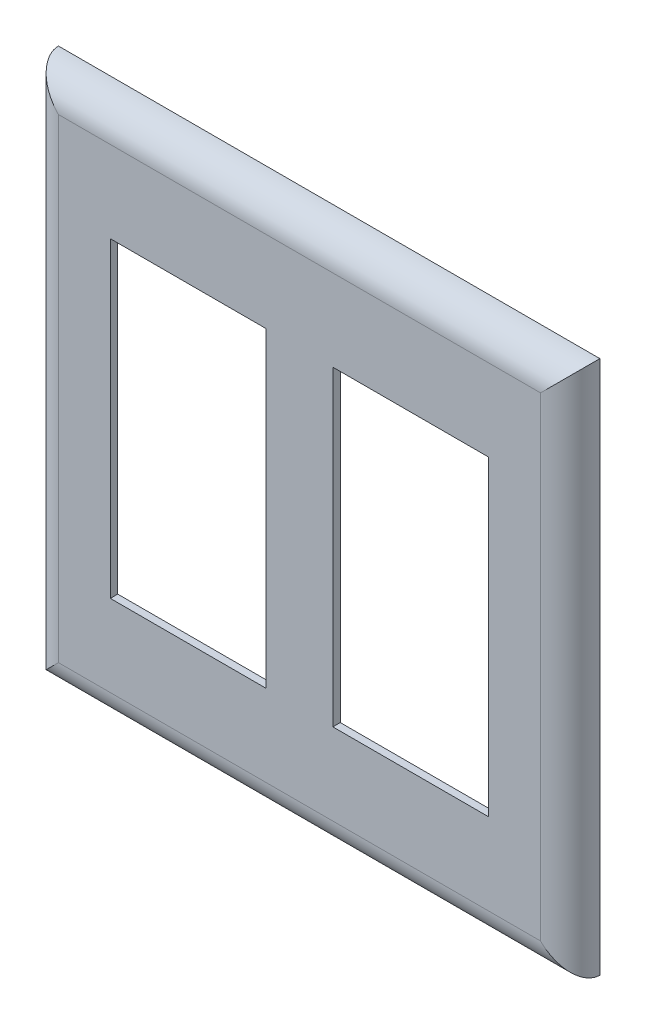
ISO-10303-21;
HEADER;
FILE_DESCRIPTION(('STEP AP214'),'2;1');
FILE_NAME('part.step','',(''),(''),'','','');
FILE_SCHEMA(('AUTOMOTIVE_DESIGN { 1 0 10303 214 1 1 1 1 }'));
ENDSEC;
DATA;
#1=APPLICATION_CONTEXT('core data for automotive mechanical design processes');
#2=APPLICATION_PROTOCOL_DEFINITION('international standard','automotive_design',2000,#1);
#3=PRODUCT_CONTEXT('',#1,'mechanical');
#4=PRODUCT('Part','Part','',(#3));
#5=PRODUCT_RELATED_PRODUCT_CATEGORY('part','',(#4));
#6=PRODUCT_DEFINITION_FORMATION('','',#4);
#7=PRODUCT_DEFINITION_CONTEXT('part definition',#1,'design');
#8=PRODUCT_DEFINITION('design','',#6,#7);
#9=PRODUCT_DEFINITION_SHAPE('','',#8);
#10=(LENGTH_UNIT() NAMED_UNIT(*) SI_UNIT(.MILLI.,.METRE.));
#11=(NAMED_UNIT(*) PLANE_ANGLE_UNIT() SI_UNIT($,.RADIAN.));
#12=(NAMED_UNIT(*) SI_UNIT($,.STERADIAN.) SOLID_ANGLE_UNIT());
#13=UNCERTAINTY_MEASURE_WITH_UNIT(LENGTH_MEASURE(1.E-05),#10,'distance_accuracy_value','');
#14=(GEOMETRIC_REPRESENTATION_CONTEXT(3) GLOBAL_UNCERTAINTY_ASSIGNED_CONTEXT((#13)) GLOBAL_UNIT_ASSIGNED_CONTEXT((#10,
#11,#12)) REPRESENTATION_CONTEXT('',''));
#15=CARTESIAN_POINT('',(0.,0.,0.));
#16=DIRECTION('',(0.,0.,1.));
#17=DIRECTION('',(1.,0.,0.));
#18=AXIS2_PLACEMENT_3D('',#15,#16,#17);
#19=CARTESIAN_POINT('',(-40.48896695132,33.3375,6.35));
#20=DIRECTION('',(1.,0.,0.));
#21=DIRECTION('',(0.,1.,0.));
#22=AXIS2_PLACEMENT_3D('',#19,#20,#21);
#23=PLANE('',#22);
#24=DIRECTION('',(0.,0.,-1.));
#25=VECTOR('',#24,1.);
#26=CARTESIAN_POINT('',(-40.48896695132,-33.3375,6.35));
#27=LINE('',#26,#25);
#28=CARTESIAN_POINT('',(-40.48896695132,-33.3375,6.35));
#29=VERTEX_POINT('',#28);
#30=CARTESIAN_POINT('',(-40.48896695132,-33.3375,4.7625));
#31=VERTEX_POINT('',#30);
#32=EDGE_CURVE('E299',#29,#31,#27,.T.);
#33=ORIENTED_EDGE('',*,*,#32,.T.);
#34=DIRECTION('',(0.,1.,0.));
#35=VECTOR('',#34,1.);
#36=CARTESIAN_POINT('',(-40.48896695132,33.3375,4.7625));
#37=LINE('',#36,#35);
#38=CARTESIAN_POINT('',(-40.48896695132,33.3375,4.7625));
#39=VERTEX_POINT('',#38);
#40=EDGE_CURVE('E241',#31,#39,#37,.T.);
#41=ORIENTED_EDGE('',*,*,#40,.T.);
#42=DIRECTION('',(0.,0.,-1.));
#43=VECTOR('',#42,1.);
#44=CARTESIAN_POINT('',(-40.48896695132,33.3375,6.35));
#45=LINE('',#44,#43);
#46=CARTESIAN_POINT('',(-40.48896695132,33.3375,6.35));
#47=VERTEX_POINT('',#46);
#48=EDGE_CURVE('E287',#47,#39,#45,.T.);
#49=ORIENTED_EDGE('',*,*,#48,.F.);
#50=DIRECTION('',(0.,-1.,0.));
#51=VECTOR('',#50,1.);
#52=CARTESIAN_POINT('',(-40.48896695132,33.3375,6.35));
#53=LINE('',#52,#51);
#54=EDGE_CURVE('E274',#47,#29,#53,.T.);
#55=ORIENTED_EDGE('',*,*,#54,.T.);
#56=EDGE_LOOP('',(#33,#41,#49,#55));
#57=FACE_BOUND('',#56,.T.);
#58=ADVANCED_FACE('F39',(#57),#23,.T.);
#59=CARTESIAN_POINT('',(-40.48896695132,-33.3375,6.35));
#60=DIRECTION('',(0.,1.,0.));
#61=DIRECTION('',(0.,0.,1.));
#62=AXIS2_PLACEMENT_3D('',#59,#60,#61);
#63=PLANE('',#62);
#64=DIRECTION('',(0.,0.,-1.));
#65=VECTOR('',#64,1.);
#66=CARTESIAN_POINT('',(-7.15146695131999,-33.3375,6.35));
#67=LINE('',#66,#65);
#68=CARTESIAN_POINT('',(-7.15146695131999,-33.3375,6.35));
#69=VERTEX_POINT('',#68);
#70=CARTESIAN_POINT('',(-7.15146695131999,-33.3375,4.7625));
#71=VERTEX_POINT('',#70);
#72=EDGE_CURVE('E295',#69,#71,#67,.T.);
#73=ORIENTED_EDGE('',*,*,#72,.T.);
#74=DIRECTION('',(-1.,0.,0.));
#75=VECTOR('',#74,1.);
#76=CARTESIAN_POINT('',(-40.48896695132,-33.3375,4.7625));
#77=LINE('',#76,#75);
#78=EDGE_CURVE('E237',#71,#31,#77,.T.);
#79=ORIENTED_EDGE('',*,*,#78,.T.);
#80=ORIENTED_EDGE('',*,*,#32,.F.);
#81=DIRECTION('',(1.,0.,0.));
#82=VECTOR('',#81,1.);
#83=CARTESIAN_POINT('',(-40.48896695132,-33.3375,6.35));
#84=LINE('',#83,#82);
#85=EDGE_CURVE('E277',#29,#69,#84,.T.);
#86=ORIENTED_EDGE('',*,*,#85,.T.);
#87=EDGE_LOOP('',(#73,#79,#80,#86));
#88=FACE_BOUND('',#87,.T.);
#89=ADVANCED_FACE('F351',(#88),#63,.T.);
#90=CARTESIAN_POINT('',(-7.15146695132,33.3375,6.35));
#91=DIRECTION('',(-1.,0.,0.));
#92=DIRECTION('',(0.,-1.,0.));
#93=AXIS2_PLACEMENT_3D('',#90,#91,#92);
#94=PLANE('',#93);
#95=DIRECTION('',(0.,0.,-1.));
#96=VECTOR('',#95,1.);
#97=CARTESIAN_POINT('',(-7.15146695132,33.3375,6.35));
#98=LINE('',#97,#96);
#99=CARTESIAN_POINT('',(-7.15146695132,33.3375,6.35));
#100=VERTEX_POINT('',#99);
#101=CARTESIAN_POINT('',(-7.15146695132,33.3375,4.7625));
#102=VERTEX_POINT('',#101);
#103=EDGE_CURVE('E291',#100,#102,#98,.T.);
#104=ORIENTED_EDGE('',*,*,#103,.T.);
#105=DIRECTION('',(0.,-1.,0.));
#106=VECTOR('',#105,1.);
#107=CARTESIAN_POINT('',(-7.15146695132,33.3375,4.7625));
#108=LINE('',#107,#106);
#109=EDGE_CURVE('E233',#102,#71,#108,.T.);
#110=ORIENTED_EDGE('',*,*,#109,.T.);
#111=ORIENTED_EDGE('',*,*,#72,.F.);
#112=DIRECTION('',(0.,1.,0.));
#113=VECTOR('',#112,1.);
#114=CARTESIAN_POINT('',(-7.15146695132,33.3375,6.35));
#115=LINE('',#114,#113);
#116=EDGE_CURVE('E280',#69,#100,#115,.T.);
#117=ORIENTED_EDGE('',*,*,#116,.T.);
#118=EDGE_LOOP('',(#104,#110,#111,#117));
#119=FACE_BOUND('',#118,.T.);
#120=ADVANCED_FACE('F357',(#119),#94,.T.);
#121=CARTESIAN_POINT('',(-40.48896695132,33.3375,6.35));
#122=DIRECTION('',(0.,-1.,0.));
#123=DIRECTION('',(0.,0.,-1.));
#124=AXIS2_PLACEMENT_3D('',#121,#122,#123);
#125=PLANE('',#124);
#126=ORIENTED_EDGE('',*,*,#48,.T.);
#127=DIRECTION('',(1.,0.,0.));
#128=VECTOR('',#127,1.);
#129=CARTESIAN_POINT('',(-40.48896695132,33.3375,4.7625));
#130=LINE('',#129,#128);
#131=EDGE_CURVE('E229',#39,#102,#130,.T.);
#132=ORIENTED_EDGE('',*,*,#131,.T.);
#133=ORIENTED_EDGE('',*,*,#103,.F.);
#134=DIRECTION('',(-1.,0.,0.));
#135=VECTOR('',#134,1.);
#136=CARTESIAN_POINT('',(-40.48896695132,33.3375,6.35));
#137=LINE('',#136,#135);
#138=EDGE_CURVE('E284',#100,#47,#137,.T.);
#139=ORIENTED_EDGE('',*,*,#138,.T.);
#140=EDGE_LOOP('',(#126,#132,#133,#139));
#141=FACE_BOUND('',#140,.T.);
#142=ADVANCED_FACE('F482',(#141),#125,.T.);
#143=CARTESIAN_POINT('',(7.14375,33.3375,6.35));
#144=DIRECTION('',(1.,0.,0.));
#145=DIRECTION('',(0.,1.,0.));
#146=AXIS2_PLACEMENT_3D('',#143,#144,#145);
#147=PLANE('',#146);
#148=DIRECTION('',(0.,0.,-1.));
#149=VECTOR('',#148,1.);
#150=CARTESIAN_POINT('',(7.14375000000001,-33.3375,6.35));
#151=LINE('',#150,#149);
#152=CARTESIAN_POINT('',(7.14375000000001,-33.3375,6.35));
#153=VERTEX_POINT('',#152);
#154=CARTESIAN_POINT('',(7.14375000000001,-33.3375,4.7625));
#155=VERTEX_POINT('',#154);
#156=EDGE_CURVE('E270',#153,#155,#151,.T.);
#157=ORIENTED_EDGE('',*,*,#156,.T.);
#158=DIRECTION('',(0.,1.,0.));
#159=VECTOR('',#158,1.);
#160=CARTESIAN_POINT('',(7.14375,33.3375,4.7625));
#161=LINE('',#160,#159);
#162=CARTESIAN_POINT('',(7.14375,33.3375,4.7625));
#163=VERTEX_POINT('',#162);
#164=EDGE_CURVE('E225',#155,#163,#161,.T.);
#165=ORIENTED_EDGE('',*,*,#164,.T.);
#166=DIRECTION('',(0.,0.,-1.));
#167=VECTOR('',#166,1.);
#168=CARTESIAN_POINT('',(7.14375,33.3375,6.35));
#169=LINE('',#168,#167);
#170=CARTESIAN_POINT('',(7.14375,33.3375,6.35));
#171=VERTEX_POINT('',#170);
#172=EDGE_CURVE('E258',#171,#163,#169,.T.);
#173=ORIENTED_EDGE('',*,*,#172,.F.);
#174=DIRECTION('',(0.,-1.,0.));
#175=VECTOR('',#174,1.);
#176=CARTESIAN_POINT('',(7.14375,33.3375,6.35));
#177=LINE('',#176,#175);
#178=EDGE_CURVE('E245',#171,#153,#177,.T.);
#179=ORIENTED_EDGE('',*,*,#178,.T.);
#180=EDGE_LOOP('',(#157,#165,#173,#179));
#181=FACE_BOUND('',#180,.T.);
#182=ADVANCED_FACE('F472',(#181),#147,.T.);
#183=CARTESIAN_POINT('',(7.14375000000001,-33.3375,6.35));
#184=DIRECTION('',(0.,1.,0.));
#185=DIRECTION('',(0.,0.,1.));
#186=AXIS2_PLACEMENT_3D('',#183,#184,#185);
#187=PLANE('',#186);
#188=DIRECTION('',(0.,0.,-1.));
#189=VECTOR('',#188,1.);
#190=CARTESIAN_POINT('',(40.48125,-33.3375,6.35));
#191=LINE('',#190,#189);
#192=CARTESIAN_POINT('',(40.48125,-33.3375,6.35));
#193=VERTEX_POINT('',#192);
#194=CARTESIAN_POINT('',(40.48125,-33.3375,4.7625));
#195=VERTEX_POINT('',#194);
#196=EDGE_CURVE('E266',#193,#195,#191,.T.);
#197=ORIENTED_EDGE('',*,*,#196,.T.);
#198=DIRECTION('',(-1.,0.,0.));
#199=VECTOR('',#198,1.);
#200=CARTESIAN_POINT('',(7.14375000000001,-33.3375,4.7625));
#201=LINE('',#200,#199);
#202=EDGE_CURVE('E221',#195,#155,#201,.T.);
#203=ORIENTED_EDGE('',*,*,#202,.T.);
#204=ORIENTED_EDGE('',*,*,#156,.F.);
#205=DIRECTION('',(1.,0.,0.));
#206=VECTOR('',#205,1.);
#207=CARTESIAN_POINT('',(7.14375000000001,-33.3375,6.35));
#208=LINE('',#207,#206);
#209=EDGE_CURVE('E248',#153,#193,#208,.T.);
#210=ORIENTED_EDGE('',*,*,#209,.T.);
#211=EDGE_LOOP('',(#197,#203,#204,#210));
#212=FACE_BOUND('',#211,.T.);
#213=ADVANCED_FACE('F462',(#212),#187,.T.);
#214=CARTESIAN_POINT('',(40.48125,33.3375,6.35));
#215=DIRECTION('',(-1.,0.,0.));
#216=DIRECTION('',(0.,-1.,0.));
#217=AXIS2_PLACEMENT_3D('',#214,#215,#216);
#218=PLANE('',#217);
#219=DIRECTION('',(0.,0.,-1.));
#220=VECTOR('',#219,1.);
#221=CARTESIAN_POINT('',(40.48125,33.3375,6.35));
#222=LINE('',#221,#220);
#223=CARTESIAN_POINT('',(40.48125,33.3375,6.35));
#224=VERTEX_POINT('',#223);
#225=CARTESIAN_POINT('',(40.48125,33.3375,4.7625));
#226=VERTEX_POINT('',#225);
#227=EDGE_CURVE('E262',#224,#226,#222,.T.);
#228=ORIENTED_EDGE('',*,*,#227,.T.);
#229=DIRECTION('',(0.,-1.,0.));
#230=VECTOR('',#229,1.);
#231=CARTESIAN_POINT('',(40.48125,33.3375,4.7625));
#232=LINE('',#231,#230);
#233=EDGE_CURVE('E217',#226,#195,#232,.T.);
#234=ORIENTED_EDGE('',*,*,#233,.T.);
#235=ORIENTED_EDGE('',*,*,#196,.F.);
#236=DIRECTION('',(0.,1.,0.));
#237=VECTOR('',#236,1.);
#238=CARTESIAN_POINT('',(40.48125,33.3375,6.35));
#239=LINE('',#238,#237);
#240=EDGE_CURVE('E251',#193,#224,#239,.T.);
#241=ORIENTED_EDGE('',*,*,#240,.T.);
#242=EDGE_LOOP('',(#228,#234,#235,#241));
#243=FACE_BOUND('',#242,.T.);
#244=ADVANCED_FACE('F452',(#243),#218,.T.);
#245=CARTESIAN_POINT('',(7.14375,33.3375,6.35));
#246=DIRECTION('',(0.,-1.,0.));
#247=DIRECTION('',(0.,0.,-1.));
#248=AXIS2_PLACEMENT_3D('',#245,#246,#247);
#249=PLANE('',#248);
#250=ORIENTED_EDGE('',*,*,#172,.T.);
#251=DIRECTION('',(1.,0.,0.));
#252=VECTOR('',#251,1.);
#253=CARTESIAN_POINT('',(7.14375,33.3375,4.7625));
#254=LINE('',#253,#252);
#255=EDGE_CURVE('E316',#163,#226,#254,.T.);
#256=ORIENTED_EDGE('',*,*,#255,.T.);
#257=ORIENTED_EDGE('',*,*,#227,.F.);
#258=DIRECTION('',(-1.,0.,0.));
#259=VECTOR('',#258,1.);
#260=CARTESIAN_POINT('',(7.14375,33.3375,6.35));
#261=LINE('',#260,#259);
#262=EDGE_CURVE('E255',#224,#171,#261,.T.);
#263=ORIENTED_EDGE('',*,*,#262,.T.);
#264=EDGE_LOOP('',(#250,#256,#257,#263));
#265=FACE_BOUND('',#264,.T.);
#266=ADVANCED_FACE('F365',(#265),#249,.T.);
#267=CARTESIAN_POINT('',(0.,0.,6.35));
#268=DIRECTION('',(0.,0.,1.));
#269=DIRECTION('',(1.,0.,0.));
#270=AXIS2_PLACEMENT_3D('',#267,#268,#269);
#271=PLANE('',#270);
#272=DIRECTION('',(0.,1.,0.));
#273=VECTOR('',#272,1.);
#274=CARTESIAN_POINT('',(51.59375,57.15,6.35));
#275=LINE('',#274,#273);
#276=CARTESIAN_POINT('',(51.59375,-50.8,6.35));
#277=VERTEX_POINT('',#276);
#278=CARTESIAN_POINT('',(51.59375,50.8,6.35));
#279=VERTEX_POINT('',#278);
#280=EDGE_CURVE('E320',#277,#279,#275,.T.);
#281=ORIENTED_EDGE('',*,*,#280,.T.);
#282=DIRECTION('',(-1.,0.,0.));
#283=VECTOR('',#282,1.);
#284=CARTESIAN_POINT('',(-57.94375,50.8,6.35));
#285=LINE('',#284,#283);
#286=CARTESIAN_POINT('',(-51.59375,50.8,6.35));
#287=VERTEX_POINT('',#286);
#288=EDGE_CURVE('E329',#279,#287,#285,.T.);
#289=ORIENTED_EDGE('',*,*,#288,.T.);
#290=DIRECTION('',(0.,-1.,0.));
#291=VECTOR('',#290,1.);
#292=CARTESIAN_POINT('',(-51.59375,-57.15,6.35));
#293=LINE('',#292,#291);
#294=CARTESIAN_POINT('',(-51.59375,-50.8,6.35));
#295=VERTEX_POINT('',#294);
#296=EDGE_CURVE('E326',#287,#295,#293,.T.);
#297=ORIENTED_EDGE('',*,*,#296,.T.);
#298=DIRECTION('',(1.,0.,0.));
#299=VECTOR('',#298,1.);
#300=CARTESIAN_POINT('',(57.94375,-50.8,6.35));
#301=LINE('',#300,#299);
#302=EDGE_CURVE('E323',#295,#277,#301,.T.);
#303=ORIENTED_EDGE('',*,*,#302,.T.);
#304=EDGE_LOOP('',(#281,#289,#297,#303));
#305=FACE_BOUND('',#304,.T.);
#306=ORIENTED_EDGE('',*,*,#85,.F.);
#307=ORIENTED_EDGE('',*,*,#54,.F.);
#308=ORIENTED_EDGE('',*,*,#138,.F.);
#309=ORIENTED_EDGE('',*,*,#116,.F.);
#310=EDGE_LOOP('',(#306,#307,#308,#309));
#311=FACE_BOUND('',#310,.T.);
#312=ORIENTED_EDGE('',*,*,#209,.F.);
#313=ORIENTED_EDGE('',*,*,#178,.F.);
#314=ORIENTED_EDGE('',*,*,#262,.F.);
#315=ORIENTED_EDGE('',*,*,#240,.F.);
#316=EDGE_LOOP('',(#312,#313,#314,#315));
#317=FACE_BOUND('',#316,.T.);
#318=ADVANCED_FACE('F362',(#305,#311,#317),#271,.T.);
#319=CARTESIAN_POINT('',(0.,0.,0.));
#320=DIRECTION('',(0.,0.,1.));
#321=DIRECTION('',(1.,0.,0.));
#322=AXIS2_PLACEMENT_3D('',#319,#320,#321);
#323=PLANE('',#322);
#324=DIRECTION('',(-1.,0.,0.));
#325=VECTOR('',#324,1.);
#326=CARTESIAN_POINT('',(56.35625,-55.5625,0.));
#327=LINE('',#326,#325);
#328=CARTESIAN_POINT('',(56.35625,-55.5625,0.));
#329=VERTEX_POINT('',#328);
#330=CARTESIAN_POINT('',(-56.35625,-55.5625,0.));
#331=VERTEX_POINT('',#330);
#332=EDGE_CURVE('E158',#329,#331,#327,.T.);
#333=ORIENTED_EDGE('',*,*,#332,.F.);
#334=DIRECTION('',(0.,-1.,0.));
#335=VECTOR('',#334,1.);
#336=CARTESIAN_POINT('',(56.35625,55.5625,0.));
#337=LINE('',#336,#335);
#338=CARTESIAN_POINT('',(56.35625,55.5625,0.));
#339=VERTEX_POINT('',#338);
#340=EDGE_CURVE('E171',#339,#329,#337,.T.);
#341=ORIENTED_EDGE('',*,*,#340,.F.);
#342=DIRECTION('',(1.,0.,0.));
#343=VECTOR('',#342,1.);
#344=CARTESIAN_POINT('',(-56.35625,55.5625,0.));
#345=LINE('',#344,#343);
#346=CARTESIAN_POINT('',(-56.35625,55.5625,0.));
#347=VERTEX_POINT('',#346);
#348=EDGE_CURVE('E160',#347,#339,#345,.T.);
#349=ORIENTED_EDGE('',*,*,#348,.F.);
#350=DIRECTION('',(0.,1.,0.));
#351=VECTOR('',#350,1.);
#352=CARTESIAN_POINT('',(-56.35625,-55.5625,0.));
#353=LINE('',#352,#351);
#354=EDGE_CURVE('E155',#331,#347,#353,.T.);
#355=ORIENTED_EDGE('',*,*,#354,.F.);
#356=EDGE_LOOP('',(#333,#341,#349,#355));
#357=FACE_BOUND('',#356,.T.);
#358=DIRECTION('',(0.,1.,0.));
#359=VECTOR('',#358,1.);
#360=CARTESIAN_POINT('',(57.94375,57.15,0.));
#361=LINE('',#360,#359);
#362=CARTESIAN_POINT('',(57.94375,-57.15,0.));
#363=VERTEX_POINT('',#362);
#364=CARTESIAN_POINT('',(57.94375,57.15,0.));
#365=VERTEX_POINT('',#364);
#366=EDGE_CURVE('E303',#363,#365,#361,.T.);
#367=ORIENTED_EDGE('',*,*,#366,.F.);
#368=DIRECTION('',(1.,0.,0.));
#369=VECTOR('',#368,1.);
#370=CARTESIAN_POINT('',(-57.94375,-57.15,0.));
#371=LINE('',#370,#369);
#372=CARTESIAN_POINT('',(-57.94375,-57.15,0.));
#373=VERTEX_POINT('',#372);
#374=EDGE_CURVE('E312',#373,#363,#371,.T.);
#375=ORIENTED_EDGE('',*,*,#374,.F.);
#376=DIRECTION('',(0.,-1.,0.));
#377=VECTOR('',#376,1.);
#378=CARTESIAN_POINT('',(-57.94375,57.15,0.));
#379=LINE('',#378,#377);
#380=CARTESIAN_POINT('',(-57.94375,57.15,0.));
#381=VERTEX_POINT('',#380);
#382=EDGE_CURVE('E309',#381,#373,#379,.T.);
#383=ORIENTED_EDGE('',*,*,#382,.F.);
#384=DIRECTION('',(-1.,0.,0.));
#385=VECTOR('',#384,1.);
#386=CARTESIAN_POINT('',(-57.94375,57.15,0.));
#387=LINE('',#386,#385);
#388=EDGE_CURVE('E306',#365,#381,#387,.T.);
#389=ORIENTED_EDGE('',*,*,#388,.F.);
#390=EDGE_LOOP('',(#367,#375,#383,#389));
#391=FACE_BOUND('',#390,.T.);
#392=ADVANCED_FACE('F156',(#357,#391),#323,.F.);
#393=CARTESIAN_POINT('',(0.,0.,4.7625));
#394=DIRECTION('',(0.,0.,-1.));
#395=DIRECTION('',(-1.,0.,0.));
#396=AXIS2_PLACEMENT_3D('',#393,#394,#395);
#397=PLANE('',#396);
#398=DIRECTION('',(0.,1.,0.));
#399=VECTOR('',#398,1.);
#400=CARTESIAN_POINT('',(50.2078889378957,-55.5625,4.7625));
#401=LINE('',#400,#399);
#402=CARTESIAN_POINT('',(50.2078889378957,49.4141389378957,4.7625));
#403=VERTEX_POINT('',#402);
#404=CARTESIAN_POINT('',(50.2078889378957,-49.4141389378957,4.7625));
#405=VERTEX_POINT('',#404);
#406=EDGE_CURVE('E333',#403,#405,#401,.F.);
#407=ORIENTED_EDGE('',*,*,#406,.T.);
#408=DIRECTION('',(1.,0.,0.));
#409=VECTOR('',#408,1.);
#410=CARTESIAN_POINT('',(-56.35625,-49.4141389378957,4.7625));
#411=LINE('',#410,#409);
#412=CARTESIAN_POINT('',(-50.2078889378957,-49.4141389378957,4.7625));
#413=VERTEX_POINT('',#412);
#414=EDGE_CURVE('E11',#405,#413,#411,.F.);
#415=ORIENTED_EDGE('',*,*,#414,.T.);
#416=DIRECTION('',(0.,-1.,0.));
#417=VECTOR('',#416,1.);
#418=CARTESIAN_POINT('',(-50.2078889378957,55.5625,4.7625));
#419=LINE('',#418,#417);
#420=CARTESIAN_POINT('',(-50.2078889378957,49.4141389378957,4.7625));
#421=VERTEX_POINT('',#420);
#422=EDGE_CURVE('E49',#413,#421,#419,.F.);
#423=ORIENTED_EDGE('',*,*,#422,.T.);
#424=DIRECTION('',(-1.,0.,0.));
#425=VECTOR('',#424,1.);
#426=CARTESIAN_POINT('',(56.35625,49.4141389378957,4.7625));
#427=LINE('',#426,#425);
#428=EDGE_CURVE('E336',#421,#403,#427,.F.);
#429=ORIENTED_EDGE('',*,*,#428,.T.);
#430=EDGE_LOOP('',(#407,#415,#423,#429));
#431=FACE_BOUND('',#430,.T.);
#432=ORIENTED_EDGE('',*,*,#78,.F.);
#433=ORIENTED_EDGE('',*,*,#109,.F.);
#434=ORIENTED_EDGE('',*,*,#131,.F.);
#435=ORIENTED_EDGE('',*,*,#40,.F.);
#436=EDGE_LOOP('',(#432,#433,#434,#435));
#437=FACE_BOUND('',#436,.T.);
#438=ORIENTED_EDGE('',*,*,#202,.F.);
#439=ORIENTED_EDGE('',*,*,#233,.F.);
#440=ORIENTED_EDGE('',*,*,#255,.F.);
#441=ORIENTED_EDGE('',*,*,#164,.F.);
#442=EDGE_LOOP('',(#438,#439,#440,#441));
#443=FACE_BOUND('',#442,.T.);
#444=ADVANCED_FACE('F339',(#431,#437,#443),#397,.T.);
#445=CARTESIAN_POINT('',(0.,-50.8,0.));
#446=DIRECTION('',(-1.,0.,0.));
#447=DIRECTION('',(0.,0.,1.));
#448=AXIS2_PLACEMENT_3D('',#445,#446,#447);
#449=CYLINDRICAL_SURFACE('',#448,6.35);
#450=CARTESIAN_POINT('',(-51.59375,-50.8,0.));
#451=DIRECTION('',(-0.707106781186547,0.707106781186547,0.));
#452=DIRECTION('',(-0.707106781186547,-0.707106781186548,0.));
#453=AXIS2_PLACEMENT_3D('',#450,#451,#452);
#454=ELLIPSE('',#453,8.98025612106915,6.35);
#455=EDGE_CURVE('E198',#373,#295,#454,.T.);
#456=ORIENTED_EDGE('',*,*,#455,.F.);
#457=ORIENTED_EDGE('',*,*,#374,.T.);
#458=CARTESIAN_POINT('',(51.59375,-50.8,0.));
#459=DIRECTION('',(-0.707106781186547,-0.707106781186548,0.));
#460=DIRECTION('',(0.707106781186548,-0.707106781186547,0.));
#461=AXIS2_PLACEMENT_3D('',#458,#459,#460);
#462=ELLIPSE('',#461,8.98025612106915,6.35);
#463=EDGE_CURVE('E180',#277,#363,#462,.F.);
#464=ORIENTED_EDGE('',*,*,#463,.F.);
#465=ORIENTED_EDGE('',*,*,#302,.F.);
#466=EDGE_LOOP('',(#456,#457,#464,#465));
#467=FACE_BOUND('',#466,.T.);
#468=ADVANCED_FACE('F377',(#467),#449,.T.);
#469=CARTESIAN_POINT('',(51.59375,0.,0.));
#470=DIRECTION('',(0.,-1.,0.));
#471=DIRECTION('',(1.,0.,0.));
#472=AXIS2_PLACEMENT_3D('',#469,#470,#471);
#473=CYLINDRICAL_SURFACE('',#472,6.35);
#474=ORIENTED_EDGE('',*,*,#463,.T.);
#475=ORIENTED_EDGE('',*,*,#366,.T.);
#476=CARTESIAN_POINT('',(51.59375,50.8,0.));
#477=DIRECTION('',(0.707106781186548,-0.707106781186547,0.));
#478=DIRECTION('',(-0.707106781186547,-0.707106781186548,0.));
#479=AXIS2_PLACEMENT_3D('',#476,#477,#478);
#480=ELLIPSE('',#479,8.98025612106915,6.35);
#481=EDGE_CURVE('E190',#279,#365,#480,.F.);
#482=ORIENTED_EDGE('',*,*,#481,.F.);
#483=ORIENTED_EDGE('',*,*,#280,.F.);
#484=EDGE_LOOP('',(#474,#475,#482,#483));
#485=FACE_BOUND('',#484,.T.);
#486=ADVANCED_FACE('F374',(#485),#473,.T.);
#487=CARTESIAN_POINT('',(-51.59375,0.,0.));
#488=DIRECTION('',(0.,1.,0.));
#489=DIRECTION('',(-1.,0.,0.));
#490=AXIS2_PLACEMENT_3D('',#487,#488,#489);
#491=CYLINDRICAL_SURFACE('',#490,6.35);
#492=ORIENTED_EDGE('',*,*,#455,.T.);
#493=ORIENTED_EDGE('',*,*,#296,.F.);
#494=CARTESIAN_POINT('',(-51.59375,50.8,0.));
#495=DIRECTION('',(0.707106781186547,0.707106781186548,0.));
#496=DIRECTION('',(-0.707106781186547,0.707106781186547,0.));
#497=AXIS2_PLACEMENT_3D('',#494,#495,#496);
#498=ELLIPSE('',#497,8.98025612106915,6.35);
#499=EDGE_CURVE('E185',#381,#287,#498,.T.);
#500=ORIENTED_EDGE('',*,*,#499,.F.);
#501=ORIENTED_EDGE('',*,*,#382,.T.);
#502=EDGE_LOOP('',(#492,#493,#500,#501));
#503=FACE_BOUND('',#502,.T.);
#504=ADVANCED_FACE('F371',(#503),#491,.T.);
#505=CARTESIAN_POINT('',(0.,50.8,0.));
#506=DIRECTION('',(1.,0.,0.));
#507=DIRECTION('',(0.,0.,-1.));
#508=AXIS2_PLACEMENT_3D('',#505,#506,#507);
#509=CYLINDRICAL_SURFACE('',#508,6.35);
#510=ORIENTED_EDGE('',*,*,#481,.T.);
#511=ORIENTED_EDGE('',*,*,#388,.T.);
#512=ORIENTED_EDGE('',*,*,#499,.T.);
#513=ORIENTED_EDGE('',*,*,#288,.F.);
#514=EDGE_LOOP('',(#510,#511,#512,#513));
#515=FACE_BOUND('',#514,.T.);
#516=ADVANCED_FACE('F349',(#515),#509,.T.);
#517=CARTESIAN_POINT('',(-56.35625,49.4141389378957,-1.5875));
#518=DIRECTION('',(1.,0.,0.));
#519=DIRECTION('',(0.,0.,-1.));
#520=AXIS2_PLACEMENT_3D('',#517,#518,#519);
#521=CYLINDRICAL_SURFACE('',#520,6.35);
#522=CARTESIAN_POINT('',(-50.2078889378957,49.4141389378957,-1.5875));
#523=DIRECTION('',(0.707106781186547,0.707106781186548,0.));
#524=DIRECTION('',(-0.707106781186547,0.707106781186547,0.));
#525=AXIS2_PLACEMENT_3D('',#522,#523,#524);
#526=ELLIPSE('',#525,8.98025612106915,6.35);
#527=EDGE_CURVE('E177',#347,#421,#526,.T.);
#528=ORIENTED_EDGE('',*,*,#527,.F.);
#529=ORIENTED_EDGE('',*,*,#348,.T.);
#530=CARTESIAN_POINT('',(50.2078889378957,49.4141389378957,-1.5875));
#531=DIRECTION('',(0.707106781186548,-0.707106781186547,0.));
#532=DIRECTION('',(0.707106781186547,0.707106781186548,0.));
#533=AXIS2_PLACEMENT_3D('',#530,#531,#532);
#534=ELLIPSE('',#533,8.98025612106915,6.35);
#535=EDGE_CURVE('E43',#403,#339,#534,.F.);
#536=ORIENTED_EDGE('',*,*,#535,.F.);
#537=ORIENTED_EDGE('',*,*,#428,.F.);
#538=EDGE_LOOP('',(#528,#529,#536,#537));
#539=FACE_BOUND('',#538,.T.);
#540=ADVANCED_FACE('F41',(#539),#521,.F.);
#541=CARTESIAN_POINT('',(50.2078889378957,55.5625,-1.5875));
#542=DIRECTION('',(0.,-1.,0.));
#543=DIRECTION('',(1.,0.,0.));
#544=AXIS2_PLACEMENT_3D('',#541,#542,#543);
#545=CYLINDRICAL_SURFACE('',#544,6.35);
#546=ORIENTED_EDGE('',*,*,#535,.T.);
#547=ORIENTED_EDGE('',*,*,#340,.T.);
#548=CARTESIAN_POINT('',(50.2078889378957,-49.4141389378957,-1.5875));
#549=DIRECTION('',(-0.707106781186547,-0.707106781186548,0.));
#550=DIRECTION('',(-0.707106781186548,0.707106781186547,0.));
#551=AXIS2_PLACEMENT_3D('',#548,#549,#550);
#552=ELLIPSE('',#551,8.98025612106915,6.35);
#553=EDGE_CURVE('E168',#405,#329,#552,.F.);
#554=ORIENTED_EDGE('',*,*,#553,.F.);
#555=ORIENTED_EDGE('',*,*,#406,.F.);
#556=EDGE_LOOP('',(#546,#547,#554,#555));
#557=FACE_BOUND('',#556,.T.);
#558=ADVANCED_FACE('F342',(#557),#545,.F.);
#559=CARTESIAN_POINT('',(-50.2078889378957,-55.5625,-1.5875));
#560=DIRECTION('',(0.,1.,0.));
#561=DIRECTION('',(-1.,0.,0.));
#562=AXIS2_PLACEMENT_3D('',#559,#560,#561);
#563=CYLINDRICAL_SURFACE('',#562,6.35);
#564=ORIENTED_EDGE('',*,*,#527,.T.);
#565=ORIENTED_EDGE('',*,*,#422,.F.);
#566=CARTESIAN_POINT('',(-50.2078889378957,-49.4141389378957,-1.5875));
#567=DIRECTION('',(-0.707106781186547,0.707106781186547,0.));
#568=DIRECTION('',(-0.707106781186547,-0.707106781186548,0.));
#569=AXIS2_PLACEMENT_3D('',#566,#567,#568);
#570=ELLIPSE('',#569,8.98025612106915,6.35);
#571=EDGE_CURVE('E57',#331,#413,#570,.T.);
#572=ORIENTED_EDGE('',*,*,#571,.F.);
#573=ORIENTED_EDGE('',*,*,#354,.T.);
#574=EDGE_LOOP('',(#564,#565,#572,#573));
#575=FACE_BOUND('',#574,.T.);
#576=ADVANCED_FACE('F173',(#575),#563,.F.);
#577=CARTESIAN_POINT('',(56.35625,-49.4141389378957,-1.5875));
#578=DIRECTION('',(-1.,0.,0.));
#579=DIRECTION('',(0.,0.,1.));
#580=AXIS2_PLACEMENT_3D('',#577,#578,#579);
#581=CYLINDRICAL_SURFACE('',#580,6.35);
#582=ORIENTED_EDGE('',*,*,#553,.T.);
#583=ORIENTED_EDGE('',*,*,#332,.T.);
#584=ORIENTED_EDGE('',*,*,#571,.T.);
#585=ORIENTED_EDGE('',*,*,#414,.F.);
#586=EDGE_LOOP('',(#582,#583,#584,#585));
#587=FACE_BOUND('',#586,.T.);
#588=ADVANCED_FACE('F166',(#587),#581,.F.);
#589=CLOSED_SHELL('',(#58,#89,#120,#142,#182,#213,#244,#266,#318,#392,#444,#468,#486,#504,#516,
#540,#558,#576,#588));
#590=MANIFOLD_SOLID_BREP('B2',#589);
#591=ADVANCED_BREP_SHAPE_REPRESENTATION('',(#18,#590),#14);
#592=SHAPE_DEFINITION_REPRESENTATION(#9,#591);
ENDSEC;
END-ISO-10303-21;
